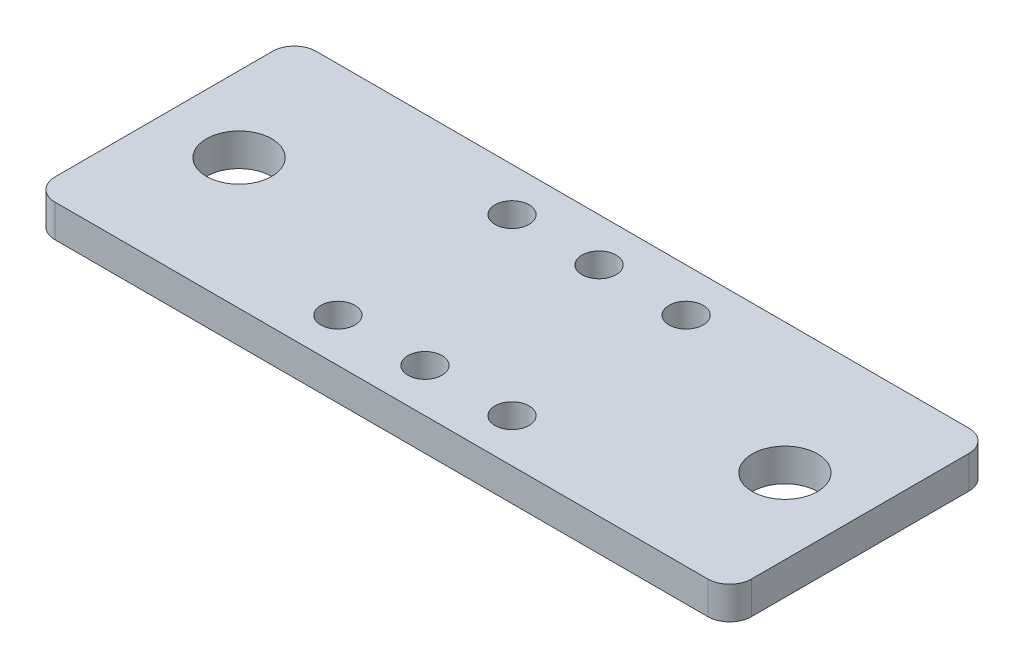
ISO-10303-21;
HEADER;
FILE_DESCRIPTION(('STEP AP214'),'2;1');
FILE_NAME('part.step','',(''),(''),'','','');
FILE_SCHEMA(('AUTOMOTIVE_DESIGN { 1 0 10303 214 1 1 1 1 }'));
ENDSEC;
DATA;
#1=APPLICATION_CONTEXT('core data for automotive mechanical design processes');
#2=APPLICATION_PROTOCOL_DEFINITION('international standard','automotive_design',2000,#1);
#3=PRODUCT_CONTEXT('',#1,'mechanical');
#4=PRODUCT('Part','Part','',(#3));
#5=PRODUCT_RELATED_PRODUCT_CATEGORY('part','',(#4));
#6=PRODUCT_DEFINITION_FORMATION('','',#4);
#7=PRODUCT_DEFINITION_CONTEXT('part definition',#1,'design');
#8=PRODUCT_DEFINITION('design','',#6,#7);
#9=PRODUCT_DEFINITION_SHAPE('','',#8);
#10=(LENGTH_UNIT() NAMED_UNIT(*) SI_UNIT(.MILLI.,.METRE.));
#11=(NAMED_UNIT(*) PLANE_ANGLE_UNIT() SI_UNIT($,.RADIAN.));
#12=(NAMED_UNIT(*) SI_UNIT($,.STERADIAN.) SOLID_ANGLE_UNIT());
#13=UNCERTAINTY_MEASURE_WITH_UNIT(LENGTH_MEASURE(1.E-05),#10,'distance_accuracy_value','');
#14=(GEOMETRIC_REPRESENTATION_CONTEXT(3) GLOBAL_UNCERTAINTY_ASSIGNED_CONTEXT((#13)) GLOBAL_UNIT_ASSIGNED_CONTEXT((#10,
#11,#12)) REPRESENTATION_CONTEXT('',''));
#15=CARTESIAN_POINT('',(0.,0.,0.));
#16=DIRECTION('',(0.,0.,1.));
#17=DIRECTION('',(1.,0.,0.));
#18=AXIS2_PLACEMENT_3D('',#15,#16,#17);
#19=CARTESIAN_POINT('',(0.,0.,0.));
#20=DIRECTION('',(0.,-1.,0.));
#21=DIRECTION('',(0.,0.,-1.));
#22=AXIS2_PLACEMENT_3D('',#19,#20,#21);
#23=PLANE('',#22);
#24=CARTESIAN_POINT('',(38.1,0.,-6.35));
#25=DIRECTION('',(0.,-1.,0.));
#26=DIRECTION('',(0.,0.,-1.));
#27=AXIS2_PLACEMENT_3D('',#24,#25,#26);
#28=CIRCLE('',#27,2.4892);
#29=CARTESIAN_POINT('',(38.1,0.,-8.83920000000001));
#30=VERTEX_POINT('',#29);
#31=EDGE_CURVE('E150',#30,#30,#28,.F.);
#32=ORIENTED_EDGE('',*,*,#31,.T.);
#33=EDGE_LOOP('',(#32));
#34=FACE_BOUND('',#33,.T.);
#35=CARTESIAN_POINT('',(63.5,0.,-6.35));
#36=DIRECTION('',(0.,-1.,0.));
#37=DIRECTION('',(0.,0.,-1.));
#38=AXIS2_PLACEMENT_3D('',#35,#36,#37);
#39=CIRCLE('',#38,2.4892);
#40=CARTESIAN_POINT('',(63.5,0.,-8.83920000000001));
#41=VERTEX_POINT('',#40);
#42=EDGE_CURVE('E156',#41,#41,#39,.F.);
#43=ORIENTED_EDGE('',*,*,#42,.T.);
#44=EDGE_LOOP('',(#43));
#45=FACE_BOUND('',#44,.T.);
#46=CARTESIAN_POINT('',(63.5,0.,-31.75));
#47=DIRECTION('',(0.,-1.,0.));
#48=DIRECTION('',(0.,0.,-1.));
#49=AXIS2_PLACEMENT_3D('',#46,#47,#48);
#50=CIRCLE('',#49,2.4892);
#51=CARTESIAN_POINT('',(63.5,0.,-34.2392));
#52=VERTEX_POINT('',#51);
#53=EDGE_CURVE('E162',#52,#52,#50,.F.);
#54=ORIENTED_EDGE('',*,*,#53,.T.);
#55=EDGE_LOOP('',(#54));
#56=FACE_BOUND('',#55,.T.);
#57=CARTESIAN_POINT('',(90.6145,0.,-19.05));
#58=DIRECTION('',(0.,-1.,0.));
#59=DIRECTION('',(0.,0.,-1.));
#60=AXIS2_PLACEMENT_3D('',#57,#58,#59);
#61=CIRCLE('',#60,4.7625);
#62=CARTESIAN_POINT('',(90.6145,0.,-23.8125));
#63=VERTEX_POINT('',#62);
#64=EDGE_CURVE('E168',#63,#63,#61,.F.);
#65=ORIENTED_EDGE('',*,*,#64,.T.);
#66=EDGE_LOOP('',(#65));
#67=FACE_BOUND('',#66,.T.);
#68=DIRECTION('',(-1.,0.,0.));
#69=VECTOR('',#68,1.);
#70=CARTESIAN_POINT('',(0.,0.,0.));
#71=LINE('',#70,#69);
#72=CARTESIAN_POINT('',(98.425,0.,0.));
#73=VERTEX_POINT('',#72);
#74=CARTESIAN_POINT('',(3.175,0.,0.));
#75=VERTEX_POINT('',#74);
#76=EDGE_CURVE('E112',#73,#75,#71,.T.);
#77=ORIENTED_EDGE('',*,*,#76,.T.);
#78=CARTESIAN_POINT('',(3.175,0.,-3.175));
#79=DIRECTION('',(0.,-1.,0.));
#80=DIRECTION('',(0.,0.,-1.));
#81=AXIS2_PLACEMENT_3D('',#78,#79,#80);
#82=CIRCLE('',#81,3.175);
#83=CARTESIAN_POINT('',(0.,0.,-3.175));
#84=VERTEX_POINT('',#83);
#85=EDGE_CURVE('E113',#84,#75,#82,.F.);
#86=ORIENTED_EDGE('',*,*,#85,.F.);
#87=DIRECTION('',(0.,0.,-1.));
#88=VECTOR('',#87,1.);
#89=CARTESIAN_POINT('',(0.,0.,0.));
#90=LINE('',#89,#88);
#91=CARTESIAN_POINT('',(0.,0.,-34.925));
#92=VERTEX_POINT('',#91);
#93=EDGE_CURVE('E107',#84,#92,#90,.T.);
#94=ORIENTED_EDGE('',*,*,#93,.T.);
#95=CARTESIAN_POINT('',(3.175,0.,-34.925));
#96=DIRECTION('',(0.,-1.,0.));
#97=DIRECTION('',(0.,0.,-1.));
#98=AXIS2_PLACEMENT_3D('',#95,#96,#97);
#99=CIRCLE('',#98,3.175);
#100=CARTESIAN_POINT('',(3.175,0.,-38.1));
#101=VERTEX_POINT('',#100);
#102=EDGE_CURVE('E110',#101,#92,#99,.F.);
#103=ORIENTED_EDGE('',*,*,#102,.F.);
#104=DIRECTION('',(1.,0.,0.));
#105=VECTOR('',#104,1.);
#106=CARTESIAN_POINT('',(0.,0.,-38.1));
#107=LINE('',#106,#105);
#108=CARTESIAN_POINT('',(98.425,0.,-38.1));
#109=VERTEX_POINT('',#108);
#110=EDGE_CURVE('E85',#101,#109,#107,.T.);
#111=ORIENTED_EDGE('',*,*,#110,.T.);
#112=CARTESIAN_POINT('',(98.425,0.,-34.925));
#113=DIRECTION('',(0.,-1.,0.));
#114=DIRECTION('',(0.,0.,-1.));
#115=AXIS2_PLACEMENT_3D('',#112,#113,#114);
#116=CIRCLE('',#115,3.175);
#117=CARTESIAN_POINT('',(101.6,0.,-34.925));
#118=VERTEX_POINT('',#117);
#119=EDGE_CURVE('E19',#118,#109,#116,.F.);
#120=ORIENTED_EDGE('',*,*,#119,.F.);
#121=DIRECTION('',(0.,0.,1.));
#122=VECTOR('',#121,1.);
#123=CARTESIAN_POINT('',(101.6,0.,0.));
#124=LINE('',#123,#122);
#125=CARTESIAN_POINT('',(101.6,0.,-3.17499999999999));
#126=VERTEX_POINT('',#125);
#127=EDGE_CURVE('E83',#118,#126,#124,.T.);
#128=ORIENTED_EDGE('',*,*,#127,.T.);
#129=CARTESIAN_POINT('',(98.425,0.,-3.17499999999999));
#130=DIRECTION('',(0.,-1.,0.));
#131=DIRECTION('',(0.,0.,-1.));
#132=AXIS2_PLACEMENT_3D('',#129,#130,#131);
#133=CIRCLE('',#132,3.175);
#134=EDGE_CURVE('E96',#73,#126,#133,.F.);
#135=ORIENTED_EDGE('',*,*,#134,.F.);
#136=EDGE_LOOP('',(#77,#86,#94,#103,#111,#120,#128,#135));
#137=FACE_BOUND('',#136,.T.);
#138=CARTESIAN_POINT('',(10.9855,0.,-19.05));
#139=DIRECTION('',(0.,-1.,0.));
#140=DIRECTION('',(0.,0.,-1.));
#141=AXIS2_PLACEMENT_3D('',#138,#139,#140);
#142=CIRCLE('',#141,4.7625);
#143=CARTESIAN_POINT('',(10.9855,0.,-23.8125));
#144=VERTEX_POINT('',#143);
#145=EDGE_CURVE('E106',#144,#144,#142,.F.);
#146=ORIENTED_EDGE('',*,*,#145,.T.);
#147=EDGE_LOOP('',(#146));
#148=FACE_BOUND('',#147,.T.);
#149=CARTESIAN_POINT('',(50.8,0.,-31.75));
#150=DIRECTION('',(0.,-1.,0.));
#151=DIRECTION('',(0.,0.,-1.));
#152=AXIS2_PLACEMENT_3D('',#149,#150,#151);
#153=CIRCLE('',#152,2.4892);
#154=CARTESIAN_POINT('',(50.8,0.,-34.2392));
#155=VERTEX_POINT('',#154);
#156=EDGE_CURVE('E165',#155,#155,#153,.F.);
#157=ORIENTED_EDGE('',*,*,#156,.T.);
#158=EDGE_LOOP('',(#157));
#159=FACE_BOUND('',#158,.T.);
#160=CARTESIAN_POINT('',(38.1,0.,-31.75));
#161=DIRECTION('',(0.,-1.,0.));
#162=DIRECTION('',(0.,0.,-1.));
#163=AXIS2_PLACEMENT_3D('',#160,#161,#162);
#164=CIRCLE('',#163,2.4892);
#165=CARTESIAN_POINT('',(38.1,0.,-34.2392));
#166=VERTEX_POINT('',#165);
#167=EDGE_CURVE('E159',#166,#166,#164,.F.);
#168=ORIENTED_EDGE('',*,*,#167,.T.);
#169=EDGE_LOOP('',(#168));
#170=FACE_BOUND('',#169,.T.);
#171=CARTESIAN_POINT('',(50.8,0.,-6.35));
#172=DIRECTION('',(0.,-1.,0.));
#173=DIRECTION('',(0.,0.,-1.));
#174=AXIS2_PLACEMENT_3D('',#171,#172,#173);
#175=CIRCLE('',#174,2.4892);
#176=CARTESIAN_POINT('',(50.8,0.,-8.8392));
#177=VERTEX_POINT('',#176);
#178=EDGE_CURVE('E153',#177,#177,#175,.F.);
#179=ORIENTED_EDGE('',*,*,#178,.T.);
#180=EDGE_LOOP('',(#179));
#181=FACE_BOUND('',#180,.T.);
#182=ADVANCED_FACE('F16',(#34,#45,#56,#67,#137,#148,#159,#170,#181),#23,.T.);
#183=CARTESIAN_POINT('',(98.425,4.7625,-34.925));
#184=DIRECTION('',(0.,-1.,0.));
#185=DIRECTION('',(0.,0.,-1.));
#186=AXIS2_PLACEMENT_3D('',#183,#184,#185);
#187=CYLINDRICAL_SURFACE('',#186,3.175);
#188=ORIENTED_EDGE('',*,*,#119,.T.);
#189=DIRECTION('',(0.,1.,0.));
#190=VECTOR('',#189,1.);
#191=CARTESIAN_POINT('',(98.425,4.7625,-38.1));
#192=LINE('',#191,#190);
#193=CARTESIAN_POINT('',(98.425,4.7625,-38.1));
#194=VERTEX_POINT('',#193);
#195=EDGE_CURVE('E184',#109,#194,#192,.T.);
#196=ORIENTED_EDGE('',*,*,#195,.T.);
#197=CARTESIAN_POINT('',(98.425,4.7625,-34.925));
#198=DIRECTION('',(0.,-1.,0.));
#199=DIRECTION('',(0.,0.,-1.));
#200=AXIS2_PLACEMENT_3D('',#197,#198,#199);
#201=CIRCLE('',#200,3.175);
#202=CARTESIAN_POINT('',(101.6,4.7625,-34.925));
#203=VERTEX_POINT('',#202);
#204=EDGE_CURVE('E100',#194,#203,#201,.T.);
#205=ORIENTED_EDGE('',*,*,#204,.T.);
#206=DIRECTION('',(0.,1.,0.));
#207=VECTOR('',#206,1.);
#208=CARTESIAN_POINT('',(101.6,4.7625,-34.925));
#209=LINE('',#208,#207);
#210=EDGE_CURVE('E90',#203,#118,#209,.F.);
#211=ORIENTED_EDGE('',*,*,#210,.T.);
#212=EDGE_LOOP('',(#188,#196,#205,#211));
#213=FACE_BOUND('',#212,.T.);
#214=ADVANCED_FACE('F99',(#213),#187,.T.);
#215=CARTESIAN_POINT('',(101.6,4.7625,0.));
#216=DIRECTION('',(-1.,0.,0.));
#217=DIRECTION('',(0.,0.,1.));
#218=AXIS2_PLACEMENT_3D('',#215,#216,#217);
#219=PLANE('',#218);
#220=ORIENTED_EDGE('',*,*,#210,.F.);
#221=DIRECTION('',(0.,0.,-1.));
#222=VECTOR('',#221,1.);
#223=CARTESIAN_POINT('',(101.6,4.7625,0.));
#224=LINE('',#223,#222);
#225=CARTESIAN_POINT('',(101.6,4.7625,-3.17499999999999));
#226=VERTEX_POINT('',#225);
#227=EDGE_CURVE('E148',#203,#226,#224,.F.);
#228=ORIENTED_EDGE('',*,*,#227,.T.);
#229=DIRECTION('',(0.,-1.,0.));
#230=VECTOR('',#229,1.);
#231=CARTESIAN_POINT('',(101.6,4.7625,-3.17499999999999));
#232=LINE('',#231,#230);
#233=EDGE_CURVE('E95',#126,#226,#232,.F.);
#234=ORIENTED_EDGE('',*,*,#233,.F.);
#235=ORIENTED_EDGE('',*,*,#127,.F.);
#236=EDGE_LOOP('',(#220,#228,#234,#235));
#237=FACE_BOUND('',#236,.T.);
#238=ADVANCED_FACE('F92',(#237),#219,.F.);
#239=CARTESIAN_POINT('',(98.425,4.7625,-3.17499999999999));
#240=DIRECTION('',(0.,-1.,0.));
#241=DIRECTION('',(0.,0.,-1.));
#242=AXIS2_PLACEMENT_3D('',#239,#240,#241);
#243=CYLINDRICAL_SURFACE('',#242,3.175);
#244=ORIENTED_EDGE('',*,*,#134,.T.);
#245=ORIENTED_EDGE('',*,*,#233,.T.);
#246=CARTESIAN_POINT('',(98.425,4.7625,-3.17499999999999));
#247=DIRECTION('',(0.,-1.,0.));
#248=DIRECTION('',(0.,0.,-1.));
#249=AXIS2_PLACEMENT_3D('',#246,#247,#248);
#250=CIRCLE('',#249,3.175);
#251=CARTESIAN_POINT('',(98.425,4.7625,0.));
#252=VERTEX_POINT('',#251);
#253=EDGE_CURVE('E145',#226,#252,#250,.T.);
#254=ORIENTED_EDGE('',*,*,#253,.T.);
#255=DIRECTION('',(0.,1.,0.));
#256=VECTOR('',#255,1.);
#257=CARTESIAN_POINT('',(98.425,4.7625,0.));
#258=LINE('',#257,#256);
#259=EDGE_CURVE('E114',#252,#73,#258,.F.);
#260=ORIENTED_EDGE('',*,*,#259,.T.);
#261=EDGE_LOOP('',(#244,#245,#254,#260));
#262=FACE_BOUND('',#261,.T.);
#263=ADVANCED_FACE('F211',(#262),#243,.T.);
#264=CARTESIAN_POINT('',(0.,4.7625,0.));
#265=DIRECTION('',(0.,0.,-1.));
#266=DIRECTION('',(-1.,0.,0.));
#267=AXIS2_PLACEMENT_3D('',#264,#265,#266);
#268=PLANE('',#267);
#269=DIRECTION('',(0.,-1.,0.));
#270=VECTOR('',#269,1.);
#271=CARTESIAN_POINT('',(3.175,4.7625,0.));
#272=LINE('',#271,#270);
#273=CARTESIAN_POINT('',(3.175,4.7625,0.));
#274=VERTEX_POINT('',#273);
#275=EDGE_CURVE('E175',#75,#274,#272,.F.);
#276=ORIENTED_EDGE('',*,*,#275,.F.);
#277=ORIENTED_EDGE('',*,*,#76,.F.);
#278=ORIENTED_EDGE('',*,*,#259,.F.);
#279=DIRECTION('',(1.,0.,0.));
#280=VECTOR('',#279,1.);
#281=CARTESIAN_POINT('',(0.,4.7625,0.));
#282=LINE('',#281,#280);
#283=EDGE_CURVE('E144',#252,#274,#282,.F.);
#284=ORIENTED_EDGE('',*,*,#283,.T.);
#285=EDGE_LOOP('',(#276,#277,#278,#284));
#286=FACE_BOUND('',#285,.T.);
#287=ADVANCED_FACE('F210',(#286),#268,.F.);
#288=CARTESIAN_POINT('',(3.175,4.7625,-3.175));
#289=DIRECTION('',(0.,-1.,0.));
#290=DIRECTION('',(0.,0.,-1.));
#291=AXIS2_PLACEMENT_3D('',#288,#289,#290);
#292=CYLINDRICAL_SURFACE('',#291,3.175);
#293=ORIENTED_EDGE('',*,*,#85,.T.);
#294=ORIENTED_EDGE('',*,*,#275,.T.);
#295=CARTESIAN_POINT('',(3.175,4.7625,-3.175));
#296=DIRECTION('',(0.,-1.,0.));
#297=DIRECTION('',(0.,0.,-1.));
#298=AXIS2_PLACEMENT_3D('',#295,#296,#297);
#299=CIRCLE('',#298,3.175);
#300=CARTESIAN_POINT('',(0.,4.7625,-3.175));
#301=VERTEX_POINT('',#300);
#302=EDGE_CURVE('E141',#274,#301,#299,.T.);
#303=ORIENTED_EDGE('',*,*,#302,.T.);
#304=DIRECTION('',(0.,1.,0.));
#305=VECTOR('',#304,1.);
#306=CARTESIAN_POINT('',(0.,4.7625,-3.175));
#307=LINE('',#306,#305);
#308=EDGE_CURVE('E111',#301,#84,#307,.F.);
#309=ORIENTED_EDGE('',*,*,#308,.T.);
#310=EDGE_LOOP('',(#293,#294,#303,#309));
#311=FACE_BOUND('',#310,.T.);
#312=ADVANCED_FACE('F206',(#311),#292,.T.);
#313=CARTESIAN_POINT('',(0.,4.7625,0.));
#314=DIRECTION('',(1.,0.,0.));
#315=DIRECTION('',(0.,0.,-1.));
#316=AXIS2_PLACEMENT_3D('',#313,#314,#315);
#317=PLANE('',#316);
#318=DIRECTION('',(0.,-1.,0.));
#319=VECTOR('',#318,1.);
#320=CARTESIAN_POINT('',(0.,4.7625,-34.925));
#321=LINE('',#320,#319);
#322=CARTESIAN_POINT('',(0.,4.7625,-34.925));
#323=VERTEX_POINT('',#322);
#324=EDGE_CURVE('E174',#92,#323,#321,.F.);
#325=ORIENTED_EDGE('',*,*,#324,.F.);
#326=ORIENTED_EDGE('',*,*,#93,.F.);
#327=ORIENTED_EDGE('',*,*,#308,.F.);
#328=DIRECTION('',(0.,0.,-1.));
#329=VECTOR('',#328,1.);
#330=CARTESIAN_POINT('',(0.,4.7625,0.));
#331=LINE('',#330,#329);
#332=EDGE_CURVE('E140',#301,#323,#331,.T.);
#333=ORIENTED_EDGE('',*,*,#332,.T.);
#334=EDGE_LOOP('',(#325,#326,#327,#333));
#335=FACE_BOUND('',#334,.T.);
#336=ADVANCED_FACE('F202',(#335),#317,.F.);
#337=CARTESIAN_POINT('',(3.175,4.7625,-34.925));
#338=DIRECTION('',(0.,-1.,0.));
#339=DIRECTION('',(0.,0.,-1.));
#340=AXIS2_PLACEMENT_3D('',#337,#338,#339);
#341=CYLINDRICAL_SURFACE('',#340,3.175);
#342=ORIENTED_EDGE('',*,*,#102,.T.);
#343=ORIENTED_EDGE('',*,*,#324,.T.);
#344=CARTESIAN_POINT('',(3.175,4.7625,-34.925));
#345=DIRECTION('',(0.,-1.,0.));
#346=DIRECTION('',(0.,0.,-1.));
#347=AXIS2_PLACEMENT_3D('',#344,#345,#346);
#348=CIRCLE('',#347,3.175);
#349=CARTESIAN_POINT('',(3.175,4.7625,-38.1));
#350=VERTEX_POINT('',#349);
#351=EDGE_CURVE('E137',#323,#350,#348,.T.);
#352=ORIENTED_EDGE('',*,*,#351,.T.);
#353=DIRECTION('',(0.,1.,0.));
#354=VECTOR('',#353,1.);
#355=CARTESIAN_POINT('',(3.175,4.7625,-38.1));
#356=LINE('',#355,#354);
#357=EDGE_CURVE('E34',#350,#101,#356,.F.);
#358=ORIENTED_EDGE('',*,*,#357,.T.);
#359=EDGE_LOOP('',(#342,#343,#352,#358));
#360=FACE_BOUND('',#359,.T.);
#361=ADVANCED_FACE('F198',(#360),#341,.T.);
#362=CARTESIAN_POINT('',(0.,4.7625,-38.1));
#363=DIRECTION('',(0.,0.,1.));
#364=DIRECTION('',(1.,0.,0.));
#365=AXIS2_PLACEMENT_3D('',#362,#363,#364);
#366=PLANE('',#365);
#367=ORIENTED_EDGE('',*,*,#357,.F.);
#368=DIRECTION('',(1.,0.,0.));
#369=VECTOR('',#368,1.);
#370=CARTESIAN_POINT('',(0.,4.7625,-38.1));
#371=LINE('',#370,#369);
#372=EDGE_CURVE('E136',#350,#194,#371,.T.);
#373=ORIENTED_EDGE('',*,*,#372,.T.);
#374=ORIENTED_EDGE('',*,*,#195,.F.);
#375=ORIENTED_EDGE('',*,*,#110,.F.);
#376=EDGE_LOOP('',(#367,#373,#374,#375));
#377=FACE_BOUND('',#376,.T.);
#378=ADVANCED_FACE('F192',(#377),#366,.F.);
#379=CARTESIAN_POINT('',(10.9855,4.7625,-19.05));
#380=DIRECTION('',(0.,-1.,0.));
#381=DIRECTION('',(0.,0.,-1.));
#382=AXIS2_PLACEMENT_3D('',#379,#380,#381);
#383=CYLINDRICAL_SURFACE('',#382,4.7625);
#384=ORIENTED_EDGE('',*,*,#145,.F.);
#385=EDGE_LOOP('',(#384));
#386=FACE_BOUND('',#385,.T.);
#387=CARTESIAN_POINT('',(10.9855,4.7625,-19.05));
#388=DIRECTION('',(0.,-1.,0.));
#389=DIRECTION('',(0.,0.,-1.));
#390=AXIS2_PLACEMENT_3D('',#387,#388,#389);
#391=CIRCLE('',#390,4.7625);
#392=CARTESIAN_POINT('',(10.9855,4.7625,-23.8125));
#393=VERTEX_POINT('',#392);
#394=EDGE_CURVE('E133',#393,#393,#391,.F.);
#395=ORIENTED_EDGE('',*,*,#394,.T.);
#396=EDGE_LOOP('',(#395));
#397=FACE_BOUND('',#396,.T.);
#398=ADVANCED_FACE('F256',(#386,#397),#383,.F.);
#399=CARTESIAN_POINT('',(90.6145,4.7625,-19.05));
#400=DIRECTION('',(0.,-1.,0.));
#401=DIRECTION('',(0.,0.,-1.));
#402=AXIS2_PLACEMENT_3D('',#399,#400,#401);
#403=CYLINDRICAL_SURFACE('',#402,4.7625);
#404=ORIENTED_EDGE('',*,*,#64,.F.);
#405=EDGE_LOOP('',(#404));
#406=FACE_BOUND('',#405,.T.);
#407=CARTESIAN_POINT('',(90.6145,4.7625,-19.05));
#408=DIRECTION('',(0.,-1.,0.));
#409=DIRECTION('',(0.,0.,-1.));
#410=AXIS2_PLACEMENT_3D('',#407,#408,#409);
#411=CIRCLE('',#410,4.7625);
#412=CARTESIAN_POINT('',(90.6145,4.7625,-23.8125));
#413=VERTEX_POINT('',#412);
#414=EDGE_CURVE('E130',#413,#413,#411,.F.);
#415=ORIENTED_EDGE('',*,*,#414,.T.);
#416=EDGE_LOOP('',(#415));
#417=FACE_BOUND('',#416,.T.);
#418=ADVANCED_FACE('F252',(#406,#417),#403,.F.);
#419=CARTESIAN_POINT('',(50.8,4.7625,-31.75));
#420=DIRECTION('',(0.,-1.,0.));
#421=DIRECTION('',(0.,0.,-1.));
#422=AXIS2_PLACEMENT_3D('',#419,#420,#421);
#423=CYLINDRICAL_SURFACE('',#422,2.4892);
#424=ORIENTED_EDGE('',*,*,#156,.F.);
#425=EDGE_LOOP('',(#424));
#426=FACE_BOUND('',#425,.T.);
#427=CARTESIAN_POINT('',(50.8,4.7625,-31.75));
#428=DIRECTION('',(0.,-1.,0.));
#429=DIRECTION('',(0.,0.,-1.));
#430=AXIS2_PLACEMENT_3D('',#427,#428,#429);
#431=CIRCLE('',#430,2.4892);
#432=CARTESIAN_POINT('',(50.8,4.7625,-34.2392));
#433=VERTEX_POINT('',#432);
#434=EDGE_CURVE('E127',#433,#433,#431,.F.);
#435=ORIENTED_EDGE('',*,*,#434,.T.);
#436=EDGE_LOOP('',(#435));
#437=FACE_BOUND('',#436,.T.);
#438=ADVANCED_FACE('F248',(#426,#437),#423,.F.);
#439=CARTESIAN_POINT('',(63.5,4.7625,-31.75));
#440=DIRECTION('',(0.,-1.,0.));
#441=DIRECTION('',(0.,0.,-1.));
#442=AXIS2_PLACEMENT_3D('',#439,#440,#441);
#443=CYLINDRICAL_SURFACE('',#442,2.4892);
#444=ORIENTED_EDGE('',*,*,#53,.F.);
#445=EDGE_LOOP('',(#444));
#446=FACE_BOUND('',#445,.T.);
#447=CARTESIAN_POINT('',(63.5,4.7625,-31.75));
#448=DIRECTION('',(0.,-1.,0.));
#449=DIRECTION('',(0.,0.,-1.));
#450=AXIS2_PLACEMENT_3D('',#447,#448,#449);
#451=CIRCLE('',#450,2.4892);
#452=CARTESIAN_POINT('',(63.5,4.7625,-34.2392));
#453=VERTEX_POINT('',#452);
#454=EDGE_CURVE('E124',#453,#453,#451,.F.);
#455=ORIENTED_EDGE('',*,*,#454,.T.);
#456=EDGE_LOOP('',(#455));
#457=FACE_BOUND('',#456,.T.);
#458=ADVANCED_FACE('F244',(#446,#457),#443,.F.);
#459=CARTESIAN_POINT('',(38.1,4.7625,-31.75));
#460=DIRECTION('',(0.,-1.,0.));
#461=DIRECTION('',(0.,0.,-1.));
#462=AXIS2_PLACEMENT_3D('',#459,#460,#461);
#463=CYLINDRICAL_SURFACE('',#462,2.4892);
#464=ORIENTED_EDGE('',*,*,#167,.F.);
#465=EDGE_LOOP('',(#464));
#466=FACE_BOUND('',#465,.T.);
#467=CARTESIAN_POINT('',(38.1,4.7625,-31.75));
#468=DIRECTION('',(0.,-1.,0.));
#469=DIRECTION('',(0.,0.,-1.));
#470=AXIS2_PLACEMENT_3D('',#467,#468,#469);
#471=CIRCLE('',#470,2.4892);
#472=CARTESIAN_POINT('',(38.1,4.7625,-34.2392));
#473=VERTEX_POINT('',#472);
#474=EDGE_CURVE('E121',#473,#473,#471,.F.);
#475=ORIENTED_EDGE('',*,*,#474,.T.);
#476=EDGE_LOOP('',(#475));
#477=FACE_BOUND('',#476,.T.);
#478=ADVANCED_FACE('F240',(#466,#477),#463,.F.);
#479=CARTESIAN_POINT('',(63.5,4.7625,-6.35));
#480=DIRECTION('',(0.,-1.,0.));
#481=DIRECTION('',(0.,0.,-1.));
#482=AXIS2_PLACEMENT_3D('',#479,#480,#481);
#483=CYLINDRICAL_SURFACE('',#482,2.4892);
#484=ORIENTED_EDGE('',*,*,#42,.F.);
#485=EDGE_LOOP('',(#484));
#486=FACE_BOUND('',#485,.T.);
#487=CARTESIAN_POINT('',(63.5,4.7625,-6.35));
#488=DIRECTION('',(0.,-1.,0.));
#489=DIRECTION('',(0.,0.,-1.));
#490=AXIS2_PLACEMENT_3D('',#487,#488,#489);
#491=CIRCLE('',#490,2.4892);
#492=CARTESIAN_POINT('',(63.5,4.7625,-8.83920000000001));
#493=VERTEX_POINT('',#492);
#494=EDGE_CURVE('E118',#493,#493,#491,.F.);
#495=ORIENTED_EDGE('',*,*,#494,.T.);
#496=EDGE_LOOP('',(#495));
#497=FACE_BOUND('',#496,.T.);
#498=ADVANCED_FACE('F236',(#486,#497),#483,.F.);
#499=CARTESIAN_POINT('',(50.8,4.7625,-6.35));
#500=DIRECTION('',(0.,-1.,0.));
#501=DIRECTION('',(0.,0.,-1.));
#502=AXIS2_PLACEMENT_3D('',#499,#500,#501);
#503=CYLINDRICAL_SURFACE('',#502,2.4892);
#504=ORIENTED_EDGE('',*,*,#178,.F.);
#505=EDGE_LOOP('',(#504));
#506=FACE_BOUND('',#505,.T.);
#507=CARTESIAN_POINT('',(50.8,4.7625,-6.35));
#508=DIRECTION('',(0.,-1.,0.));
#509=DIRECTION('',(0.,0.,-1.));
#510=AXIS2_PLACEMENT_3D('',#507,#508,#509);
#511=CIRCLE('',#510,2.4892);
#512=CARTESIAN_POINT('',(50.8,4.7625,-8.8392));
#513=VERTEX_POINT('',#512);
#514=EDGE_CURVE('E25',#513,#513,#511,.F.);
#515=ORIENTED_EDGE('',*,*,#514,.T.);
#516=EDGE_LOOP('',(#515));
#517=FACE_BOUND('',#516,.T.);
#518=ADVANCED_FACE('F228',(#506,#517),#503,.F.);
#519=CARTESIAN_POINT('',(38.1,4.7625,-6.35));
#520=DIRECTION('',(0.,-1.,0.));
#521=DIRECTION('',(0.,0.,-1.));
#522=AXIS2_PLACEMENT_3D('',#519,#520,#521);
#523=CYLINDRICAL_SURFACE('',#522,2.4892);
#524=ORIENTED_EDGE('',*,*,#31,.F.);
#525=EDGE_LOOP('',(#524));
#526=FACE_BOUND('',#525,.T.);
#527=CARTESIAN_POINT('',(38.1,4.7625,-6.35));
#528=DIRECTION('',(0.,-1.,0.));
#529=DIRECTION('',(0.,0.,-1.));
#530=AXIS2_PLACEMENT_3D('',#527,#528,#529);
#531=CIRCLE('',#530,2.4892);
#532=CARTESIAN_POINT('',(38.1,4.7625,-8.83920000000001));
#533=VERTEX_POINT('',#532);
#534=EDGE_CURVE('E11',#533,#533,#531,.F.);
#535=ORIENTED_EDGE('',*,*,#534,.T.);
#536=EDGE_LOOP('',(#535));
#537=FACE_BOUND('',#536,.T.);
#538=ADVANCED_FACE('F222',(#526,#537),#523,.F.);
#539=CARTESIAN_POINT('',(0.,4.7625,0.));
#540=DIRECTION('',(0.,-1.,0.));
#541=DIRECTION('',(0.,0.,-1.));
#542=AXIS2_PLACEMENT_3D('',#539,#540,#541);
#543=PLANE('',#542);
#544=ORIENTED_EDGE('',*,*,#534,.F.);
#545=EDGE_LOOP('',(#544));
#546=FACE_BOUND('',#545,.T.);
#547=ORIENTED_EDGE('',*,*,#514,.F.);
#548=EDGE_LOOP('',(#547));
#549=FACE_BOUND('',#548,.T.);
#550=ORIENTED_EDGE('',*,*,#494,.F.);
#551=EDGE_LOOP('',(#550));
#552=FACE_BOUND('',#551,.T.);
#553=ORIENTED_EDGE('',*,*,#474,.F.);
#554=EDGE_LOOP('',(#553));
#555=FACE_BOUND('',#554,.T.);
#556=ORIENTED_EDGE('',*,*,#454,.F.);
#557=EDGE_LOOP('',(#556));
#558=FACE_BOUND('',#557,.T.);
#559=ORIENTED_EDGE('',*,*,#434,.F.);
#560=EDGE_LOOP('',(#559));
#561=FACE_BOUND('',#560,.T.);
#562=ORIENTED_EDGE('',*,*,#414,.F.);
#563=EDGE_LOOP('',(#562));
#564=FACE_BOUND('',#563,.T.);
#565=ORIENTED_EDGE('',*,*,#394,.F.);
#566=EDGE_LOOP('',(#565));
#567=FACE_BOUND('',#566,.T.);
#568=ORIENTED_EDGE('',*,*,#351,.F.);
#569=ORIENTED_EDGE('',*,*,#332,.F.);
#570=ORIENTED_EDGE('',*,*,#302,.F.);
#571=ORIENTED_EDGE('',*,*,#283,.F.);
#572=ORIENTED_EDGE('',*,*,#253,.F.);
#573=ORIENTED_EDGE('',*,*,#227,.F.);
#574=ORIENTED_EDGE('',*,*,#204,.F.);
#575=ORIENTED_EDGE('',*,*,#372,.F.);
#576=EDGE_LOOP('',(#568,#569,#570,#571,#572,#573,#574,#575));
#577=FACE_BOUND('',#576,.T.);
#578=ADVANCED_FACE('F195',(#546,#549,#552,#555,#558,#561,#564,#567,#577),#543,.F.);
#579=CLOSED_SHELL('',(#182,#214,#238,#263,#287,#312,#336,#361,#378,#398,#418,#438,#458,#478,
#498,#518,#538,#578));
#580=MANIFOLD_SOLID_BREP('B1',#579);
#581=ADVANCED_BREP_SHAPE_REPRESENTATION('',(#18,#580),#14);
#582=SHAPE_DEFINITION_REPRESENTATION(#9,#581);
ENDSEC;
END-ISO-10303-21;
